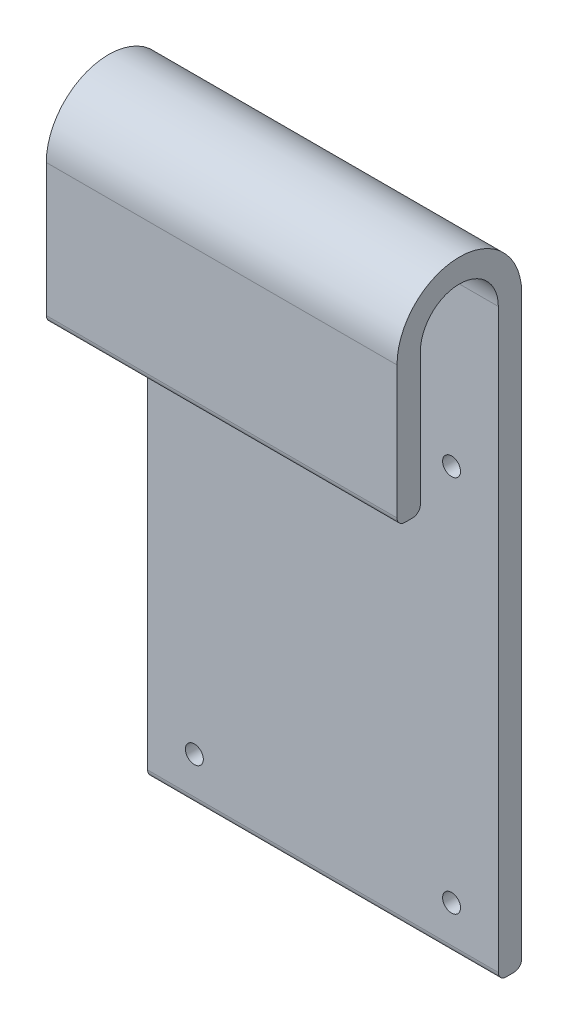
ISO-10303-21;
HEADER;
FILE_DESCRIPTION(('STEP AP214'),'2;1');
FILE_NAME('part.step','',(''),(''),'','','');
FILE_SCHEMA(('AUTOMOTIVE_DESIGN { 1 0 10303 214 1 1 1 1 }'));
ENDSEC;
DATA;
#1=APPLICATION_CONTEXT('core data for automotive mechanical design processes');
#2=APPLICATION_PROTOCOL_DEFINITION('international standard','automotive_design',2000,#1);
#3=PRODUCT_CONTEXT('',#1,'mechanical');
#4=PRODUCT('Part','Part','',(#3));
#5=PRODUCT_RELATED_PRODUCT_CATEGORY('part','',(#4));
#6=PRODUCT_DEFINITION_FORMATION('','',#4);
#7=PRODUCT_DEFINITION_CONTEXT('part definition',#1,'design');
#8=PRODUCT_DEFINITION('design','',#6,#7);
#9=PRODUCT_DEFINITION_SHAPE('','',#8);
#10=(LENGTH_UNIT() NAMED_UNIT(*) SI_UNIT(.MILLI.,.METRE.));
#11=(NAMED_UNIT(*) PLANE_ANGLE_UNIT() SI_UNIT($,.RADIAN.));
#12=(NAMED_UNIT(*) SI_UNIT($,.STERADIAN.) SOLID_ANGLE_UNIT());
#13=UNCERTAINTY_MEASURE_WITH_UNIT(LENGTH_MEASURE(1.E-05),#10,'distance_accuracy_value','');
#14=(GEOMETRIC_REPRESENTATION_CONTEXT(3) GLOBAL_UNCERTAINTY_ASSIGNED_CONTEXT((#13)) GLOBAL_UNIT_ASSIGNED_CONTEXT((#10,
#11,#12)) REPRESENTATION_CONTEXT('',''));
#15=CARTESIAN_POINT('',(0.,0.,0.));
#16=DIRECTION('',(0.,0.,1.));
#17=DIRECTION('',(1.,0.,0.));
#18=AXIS2_PLACEMENT_3D('',#15,#16,#17);
#19=CARTESIAN_POINT('',(22.5,75.,13.));
#20=DIRECTION('',(0.,0.,-1.));
#21=DIRECTION('',(0.,1.,0.));
#22=AXIS2_PLACEMENT_3D('',#19,#20,#21);
#23=PLANE('',#22);
#24=DIRECTION('',(0.,-1.,0.));
#25=VECTOR('',#24,1.);
#26=CARTESIAN_POINT('',(-22.5,75.,13.));
#27=LINE('',#26,#25);
#28=CARTESIAN_POINT('',(-22.5,75.,13.));
#29=VERTEX_POINT('',#28);
#30=CARTESIAN_POINT('',(-22.5,58.,13.));
#31=VERTEX_POINT('',#30);
#32=EDGE_CURVE('E166',#29,#31,#27,.T.);
#33=ORIENTED_EDGE('',*,*,#32,.T.);
#34=DIRECTION('',(-1.,0.,0.));
#35=VECTOR('',#34,1.);
#36=CARTESIAN_POINT('',(22.5,58.,13.));
#37=LINE('',#36,#35);
#38=CARTESIAN_POINT('',(22.5,58.,13.));
#39=VERTEX_POINT('',#38);
#40=EDGE_CURVE('E211',#31,#39,#37,.F.);
#41=ORIENTED_EDGE('',*,*,#40,.T.);
#42=DIRECTION('',(0.,-1.,0.));
#43=VECTOR('',#42,1.);
#44=CARTESIAN_POINT('',(22.5,75.,13.));
#45=LINE('',#44,#43);
#46=CARTESIAN_POINT('',(22.5,75.,13.));
#47=VERTEX_POINT('',#46);
#48=EDGE_CURVE('E185',#47,#39,#45,.T.);
#49=ORIENTED_EDGE('',*,*,#48,.F.);
#50=DIRECTION('',(-1.,0.,0.));
#51=VECTOR('',#50,1.);
#52=CARTESIAN_POINT('',(22.5,75.,13.));
#53=LINE('',#52,#51);
#54=EDGE_CURVE('E165',#47,#29,#53,.T.);
#55=ORIENTED_EDGE('',*,*,#54,.T.);
#56=EDGE_LOOP('',(#33,#41,#49,#55));
#57=FACE_BOUND('',#56,.T.);
#58=ADVANCED_FACE('F39',(#57),#23,.F.);
#59=CARTESIAN_POINT('',(22.5,57.,9.99999999999999));
#60=DIRECTION('',(0.,-1.,0.));
#61=DIRECTION('',(0.,0.,-1.));
#62=AXIS2_PLACEMENT_3D('',#59,#60,#61);
#63=PLANE('',#62);
#64=DIRECTION('',(0.,0.,1.));
#65=VECTOR('',#64,1.);
#66=CARTESIAN_POINT('',(-22.5,57.,9.99999999999999));
#67=LINE('',#66,#65);
#68=CARTESIAN_POINT('',(-22.5,57.,11.));
#69=VERTEX_POINT('',#68);
#70=CARTESIAN_POINT('',(-22.5,57.,12.));
#71=VERTEX_POINT('',#70);
#72=EDGE_CURVE('E169',#69,#71,#67,.T.);
#73=ORIENTED_EDGE('',*,*,#72,.F.);
#74=DIRECTION('',(-1.,0.,0.));
#75=VECTOR('',#74,1.);
#76=CARTESIAN_POINT('',(22.5,57.,11.));
#77=LINE('',#76,#75);
#78=CARTESIAN_POINT('',(22.5,57.,11.));
#79=VERTEX_POINT('',#78);
#80=EDGE_CURVE('E204',#69,#79,#77,.F.);
#81=ORIENTED_EDGE('',*,*,#80,.T.);
#82=DIRECTION('',(0.,0.,1.));
#83=VECTOR('',#82,1.);
#84=CARTESIAN_POINT('',(22.5,57.,9.99999999999999));
#85=LINE('',#84,#83);
#86=CARTESIAN_POINT('',(22.5,57.,12.));
#87=VERTEX_POINT('',#86);
#88=EDGE_CURVE('E149',#79,#87,#85,.T.);
#89=ORIENTED_EDGE('',*,*,#88,.T.);
#90=DIRECTION('',(-1.,0.,0.));
#91=VECTOR('',#90,1.);
#92=CARTESIAN_POINT('',(-22.5,57.,12.));
#93=LINE('',#92,#91);
#94=EDGE_CURVE('E201',#87,#71,#93,.T.);
#95=ORIENTED_EDGE('',*,*,#94,.T.);
#96=EDGE_LOOP('',(#73,#81,#89,#95));
#97=FACE_BOUND('',#96,.T.);
#98=ADVANCED_FACE('F294',(#97),#63,.T.);
#99=CARTESIAN_POINT('',(22.5,75.,10.));
#100=DIRECTION('',(0.,0.,-1.));
#101=DIRECTION('',(0.,1.,0.));
#102=AXIS2_PLACEMENT_3D('',#99,#100,#101);
#103=PLANE('',#102);
#104=DIRECTION('',(0.,-1.,0.));
#105=VECTOR('',#104,1.);
#106=CARTESIAN_POINT('',(22.5,75.,10.));
#107=LINE('',#106,#105);
#108=CARTESIAN_POINT('',(22.5,75.,9.99999999999999));
#109=VERTEX_POINT('',#108);
#110=CARTESIAN_POINT('',(22.5,58.,9.99999999999999));
#111=VERTEX_POINT('',#110);
#112=EDGE_CURVE('E132',#109,#111,#107,.T.);
#113=ORIENTED_EDGE('',*,*,#112,.T.);
#114=DIRECTION('',(-1.,0.,0.));
#115=VECTOR('',#114,1.);
#116=CARTESIAN_POINT('',(22.5,58.,9.99999999999999));
#117=LINE('',#116,#115);
#118=CARTESIAN_POINT('',(-22.5,58.,9.99999999999999));
#119=VERTEX_POINT('',#118);
#120=EDGE_CURVE('E140',#111,#119,#117,.T.);
#121=ORIENTED_EDGE('',*,*,#120,.T.);
#122=DIRECTION('',(0.,-1.,0.));
#123=VECTOR('',#122,1.);
#124=CARTESIAN_POINT('',(-22.5,75.,10.));
#125=LINE('',#124,#123);
#126=CARTESIAN_POINT('',(-22.5,75.,9.99999999999999));
#127=VERTEX_POINT('',#126);
#128=EDGE_CURVE('E135',#127,#119,#125,.T.);
#129=ORIENTED_EDGE('',*,*,#128,.F.);
#130=DIRECTION('',(-1.,0.,0.));
#131=VECTOR('',#130,1.);
#132=CARTESIAN_POINT('',(22.5,75.,9.99999999999999));
#133=LINE('',#132,#131);
#134=EDGE_CURVE('E128',#109,#127,#133,.T.);
#135=ORIENTED_EDGE('',*,*,#134,.F.);
#136=EDGE_LOOP('',(#113,#121,#129,#135));
#137=FACE_BOUND('',#136,.T.);
#138=ADVANCED_FACE('F130',(#137),#103,.T.);
#139=CARTESIAN_POINT('',(22.5,75.,5.));
#140=DIRECTION('',(-1.,0.,0.));
#141=DIRECTION('',(0.,0.,1.));
#142=AXIS2_PLACEMENT_3D('',#139,#140,#141);
#143=CYLINDRICAL_SURFACE('',#142,5.);
#144=CARTESIAN_POINT('',(-22.5,75.,5.));
#145=DIRECTION('',(1.,0.,0.));
#146=DIRECTION('',(0.,0.,-1.));
#147=AXIS2_PLACEMENT_3D('',#144,#145,#146);
#148=CIRCLE('',#147,5.);
#149=CARTESIAN_POINT('',(-22.5,75.,0.));
#150=VERTEX_POINT('',#149);
#151=EDGE_CURVE('E174',#150,#127,#148,.T.);
#152=ORIENTED_EDGE('',*,*,#151,.F.);
#153=DIRECTION('',(-1.,0.,0.));
#154=VECTOR('',#153,1.);
#155=CARTESIAN_POINT('',(22.5,75.,0.));
#156=LINE('',#155,#154);
#157=CARTESIAN_POINT('',(22.5,75.,0.));
#158=VERTEX_POINT('',#157);
#159=EDGE_CURVE('E141',#158,#150,#156,.T.);
#160=ORIENTED_EDGE('',*,*,#159,.F.);
#161=CARTESIAN_POINT('',(22.5,75.,5.));
#162=DIRECTION('',(1.,0.,0.));
#163=DIRECTION('',(0.,0.,-1.));
#164=AXIS2_PLACEMENT_3D('',#161,#162,#163);
#165=CIRCLE('',#164,5.);
#166=EDGE_CURVE('E146',#158,#109,#165,.T.);
#167=ORIENTED_EDGE('',*,*,#166,.T.);
#168=ORIENTED_EDGE('',*,*,#134,.T.);
#169=EDGE_LOOP('',(#152,#160,#167,#168));
#170=FACE_BOUND('',#169,.T.);
#171=ADVANCED_FACE('F152',(#170),#143,.F.);
#172=CARTESIAN_POINT('',(22.5,0.,0.));
#173=DIRECTION('',(0.,0.,1.));
#174=DIRECTION('',(0.,-1.,0.));
#175=AXIS2_PLACEMENT_3D('',#172,#173,#174);
#176=PLANE('',#175);
#177=CARTESIAN_POINT('',(16.4999999999863,5.74578558874435,0.));
#178=DIRECTION('',(0.,0.,1.));
#179=DIRECTION('',(0.,-1.,0.));
#180=AXIS2_PLACEMENT_3D('',#177,#178,#179);
#181=CIRCLE('',#180,1.15);
#182=CARTESIAN_POINT('',(16.4999999999863,4.59578558874435,0.));
#183=VERTEX_POINT('',#182);
#184=EDGE_CURVE('E170',#183,#183,#181,.T.);
#185=ORIENTED_EDGE('',*,*,#184,.F.);
#186=EDGE_LOOP('',(#185));
#187=FACE_BOUND('',#186,.T.);
#188=CARTESIAN_POINT('',(-16.5000000000137,5.74578558874388,0.));
#189=DIRECTION('',(0.,0.,1.));
#190=DIRECTION('',(0.,-1.,0.));
#191=AXIS2_PLACEMENT_3D('',#188,#189,#190);
#192=CIRCLE('',#191,1.15);
#193=CARTESIAN_POINT('',(-16.5000000000137,4.59578558874387,0.));
#194=VERTEX_POINT('',#193);
#195=EDGE_CURVE('E248',#194,#194,#192,.T.);
#196=ORIENTED_EDGE('',*,*,#195,.F.);
#197=EDGE_LOOP('',(#196));
#198=FACE_BOUND('',#197,.T.);
#199=CARTESIAN_POINT('',(-16.5000000000144,54.2457855887439,0.));
#200=DIRECTION('',(0.,0.,1.));
#201=DIRECTION('',(0.,-1.,0.));
#202=AXIS2_PLACEMENT_3D('',#199,#200,#201);
#203=CIRCLE('',#202,1.15);
#204=CARTESIAN_POINT('',(-16.5000000000144,53.0957855887439,0.));
#205=VERTEX_POINT('',#204);
#206=EDGE_CURVE('E251',#205,#205,#203,.T.);
#207=ORIENTED_EDGE('',*,*,#206,.F.);
#208=EDGE_LOOP('',(#207));
#209=FACE_BOUND('',#208,.T.);
#210=CARTESIAN_POINT('',(16.4999999999856,54.2457855887443,0.));
#211=DIRECTION('',(0.,0.,1.));
#212=DIRECTION('',(0.,-1.,0.));
#213=AXIS2_PLACEMENT_3D('',#210,#211,#212);
#214=CIRCLE('',#213,1.15);
#215=CARTESIAN_POINT('',(16.4999999999856,53.0957855887443,0.));
#216=VERTEX_POINT('',#215);
#217=EDGE_CURVE('E254',#216,#216,#214,.T.);
#218=ORIENTED_EDGE('',*,*,#217,.F.);
#219=EDGE_LOOP('',(#218));
#220=FACE_BOUND('',#219,.T.);
#221=DIRECTION('',(0.,1.,0.));
#222=VECTOR('',#221,1.);
#223=CARTESIAN_POINT('',(-22.5,0.,0.));
#224=LINE('',#223,#222);
#225=CARTESIAN_POINT('',(-22.5,1.,0.));
#226=VERTEX_POINT('',#225);
#227=EDGE_CURVE('E176',#226,#150,#224,.T.);
#228=ORIENTED_EDGE('',*,*,#227,.F.);
#229=DIRECTION('',(-1.,0.,0.));
#230=VECTOR('',#229,1.);
#231=CARTESIAN_POINT('',(22.5,1.,0.));
#232=LINE('',#231,#230);
#233=CARTESIAN_POINT('',(22.5,1.,0.));
#234=VERTEX_POINT('',#233);
#235=EDGE_CURVE('E11',#226,#234,#232,.F.);
#236=ORIENTED_EDGE('',*,*,#235,.T.);
#237=DIRECTION('',(0.,1.,0.));
#238=VECTOR('',#237,1.);
#239=CARTESIAN_POINT('',(22.5,0.,0.));
#240=LINE('',#239,#238);
#241=EDGE_CURVE('E154',#234,#158,#240,.T.);
#242=ORIENTED_EDGE('',*,*,#241,.T.);
#243=ORIENTED_EDGE('',*,*,#159,.T.);
#244=EDGE_LOOP('',(#228,#236,#242,#243));
#245=FACE_BOUND('',#244,.T.);
#246=ADVANCED_FACE('F322',(#187,#198,#209,#220,#245),#176,.T.);
#247=CARTESIAN_POINT('',(22.5,0.,-3.));
#248=DIRECTION('',(0.,-1.,0.));
#249=DIRECTION('',(0.,0.,-1.));
#250=AXIS2_PLACEMENT_3D('',#247,#248,#249);
#251=PLANE('',#250);
#252=DIRECTION('',(0.,0.,1.));
#253=VECTOR('',#252,1.);
#254=CARTESIAN_POINT('',(-22.5,0.,-3.));
#255=LINE('',#254,#253);
#256=CARTESIAN_POINT('',(-22.5,0.,-2.));
#257=VERTEX_POINT('',#256);
#258=CARTESIAN_POINT('',(-22.5,0.,-1.));
#259=VERTEX_POINT('',#258);
#260=EDGE_CURVE('E178',#257,#259,#255,.T.);
#261=ORIENTED_EDGE('',*,*,#260,.F.);
#262=DIRECTION('',(-1.,0.,0.));
#263=VECTOR('',#262,1.);
#264=CARTESIAN_POINT('',(22.5,0.,-2.));
#265=LINE('',#264,#263);
#266=CARTESIAN_POINT('',(22.5,0.,-2.));
#267=VERTEX_POINT('',#266);
#268=EDGE_CURVE('E47',#257,#267,#265,.F.);
#269=ORIENTED_EDGE('',*,*,#268,.T.);
#270=DIRECTION('',(0.,0.,1.));
#271=VECTOR('',#270,1.);
#272=CARTESIAN_POINT('',(22.5,0.,-3.));
#273=LINE('',#272,#271);
#274=CARTESIAN_POINT('',(22.5,0.,-1.));
#275=VERTEX_POINT('',#274);
#276=EDGE_CURVE('E156',#267,#275,#273,.T.);
#277=ORIENTED_EDGE('',*,*,#276,.T.);
#278=DIRECTION('',(-1.,0.,0.));
#279=VECTOR('',#278,1.);
#280=CARTESIAN_POINT('',(22.5,0.,-1.));
#281=LINE('',#280,#279);
#282=EDGE_CURVE('E216',#275,#259,#281,.T.);
#283=ORIENTED_EDGE('',*,*,#282,.T.);
#284=EDGE_LOOP('',(#261,#269,#277,#283));
#285=FACE_BOUND('',#284,.T.);
#286=ADVANCED_FACE('F221',(#285),#251,.T.);
#287=CARTESIAN_POINT('',(22.5,0.,-3.));
#288=DIRECTION('',(0.,0.,1.));
#289=DIRECTION('',(0.,-1.,0.));
#290=AXIS2_PLACEMENT_3D('',#287,#288,#289);
#291=PLANE('',#290);
#292=CARTESIAN_POINT('',(16.4999999999863,5.74578558874435,-3.));
#293=DIRECTION('',(0.,0.,-1.));
#294=DIRECTION('',(-1.,0.,0.));
#295=AXIS2_PLACEMENT_3D('',#292,#293,#294);
#296=CIRCLE('',#295,1.15);
#297=CARTESIAN_POINT('',(15.3499999999863,5.74578558874435,-3.));
#298=VERTEX_POINT('',#297);
#299=EDGE_CURVE('E261',#298,#298,#296,.T.);
#300=ORIENTED_EDGE('',*,*,#299,.F.);
#301=EDGE_LOOP('',(#300));
#302=FACE_BOUND('',#301,.T.);
#303=CARTESIAN_POINT('',(-16.5000000000137,5.74578558874388,-3.));
#304=DIRECTION('',(0.,0.,-1.));
#305=DIRECTION('',(-1.,0.,0.));
#306=AXIS2_PLACEMENT_3D('',#303,#304,#305);
#307=CIRCLE('',#306,1.15);
#308=CARTESIAN_POINT('',(-17.6500000000137,5.74578558874388,-3.));
#309=VERTEX_POINT('',#308);
#310=EDGE_CURVE('E264',#309,#309,#307,.T.);
#311=ORIENTED_EDGE('',*,*,#310,.F.);
#312=EDGE_LOOP('',(#311));
#313=FACE_BOUND('',#312,.T.);
#314=CARTESIAN_POINT('',(-16.5000000000144,54.2457855887439,-3.));
#315=DIRECTION('',(0.,0.,-1.));
#316=DIRECTION('',(-1.,0.,0.));
#317=AXIS2_PLACEMENT_3D('',#314,#315,#316);
#318=CIRCLE('',#317,1.15);
#319=CARTESIAN_POINT('',(-17.6500000000144,54.2457855887439,-3.));
#320=VERTEX_POINT('',#319);
#321=EDGE_CURVE('E260',#320,#320,#318,.T.);
#322=ORIENTED_EDGE('',*,*,#321,.F.);
#323=EDGE_LOOP('',(#322));
#324=FACE_BOUND('',#323,.T.);
#325=CARTESIAN_POINT('',(16.4999999999856,54.2457855887443,-3.));
#326=DIRECTION('',(0.,0.,-1.));
#327=DIRECTION('',(-1.,0.,0.));
#328=AXIS2_PLACEMENT_3D('',#325,#326,#327);
#329=CIRCLE('',#328,1.15);
#330=CARTESIAN_POINT('',(15.3499999999856,54.2457855887443,-3.));
#331=VERTEX_POINT('',#330);
#332=EDGE_CURVE('E257',#331,#331,#329,.T.);
#333=ORIENTED_EDGE('',*,*,#332,.F.);
#334=EDGE_LOOP('',(#333));
#335=FACE_BOUND('',#334,.T.);
#336=DIRECTION('',(0.,1.,0.));
#337=VECTOR('',#336,1.);
#338=CARTESIAN_POINT('',(22.5,0.,-3.));
#339=LINE('',#338,#337);
#340=CARTESIAN_POINT('',(22.5,0.999999999999999,-3.));
#341=VERTEX_POINT('',#340);
#342=CARTESIAN_POINT('',(22.5,75.,-3.));
#343=VERTEX_POINT('',#342);
#344=EDGE_CURVE('E161',#341,#343,#339,.T.);
#345=ORIENTED_EDGE('',*,*,#344,.F.);
#346=DIRECTION('',(-1.,0.,0.));
#347=VECTOR('',#346,1.);
#348=CARTESIAN_POINT('',(-22.5,0.999999999999999,-3.));
#349=LINE('',#348,#347);
#350=CARTESIAN_POINT('',(-22.5,0.999999999999999,-3.));
#351=VERTEX_POINT('',#350);
#352=EDGE_CURVE('E213',#341,#351,#349,.T.);
#353=ORIENTED_EDGE('',*,*,#352,.T.);
#354=DIRECTION('',(0.,1.,0.));
#355=VECTOR('',#354,1.);
#356=CARTESIAN_POINT('',(-22.5,0.,-3.));
#357=LINE('',#356,#355);
#358=CARTESIAN_POINT('',(-22.5,75.,-3.));
#359=VERTEX_POINT('',#358);
#360=EDGE_CURVE('E181',#351,#359,#357,.T.);
#361=ORIENTED_EDGE('',*,*,#360,.T.);
#362=DIRECTION('',(-1.,0.,0.));
#363=VECTOR('',#362,1.);
#364=CARTESIAN_POINT('',(22.5,75.,-3.));
#365=LINE('',#364,#363);
#366=EDGE_CURVE('E188',#343,#359,#365,.T.);
#367=ORIENTED_EDGE('',*,*,#366,.F.);
#368=EDGE_LOOP('',(#345,#353,#361,#367));
#369=FACE_BOUND('',#368,.T.);
#370=ADVANCED_FACE('F228',(#302,#313,#324,#335,#369),#291,.F.);
#371=CARTESIAN_POINT('',(22.5,75.,5.));
#372=DIRECTION('',(-1.,0.,0.));
#373=DIRECTION('',(0.,0.,1.));
#374=AXIS2_PLACEMENT_3D('',#371,#372,#373);
#375=CYLINDRICAL_SURFACE('',#374,8.);
#376=CARTESIAN_POINT('',(-22.5,75.,5.));
#377=DIRECTION('',(1.,0.,0.));
#378=DIRECTION('',(0.,0.,-1.));
#379=AXIS2_PLACEMENT_3D('',#376,#377,#378);
#380=CIRCLE('',#379,8.);
#381=EDGE_CURVE('E183',#359,#29,#380,.T.);
#382=ORIENTED_EDGE('',*,*,#381,.T.);
#383=ORIENTED_EDGE('',*,*,#54,.F.);
#384=CARTESIAN_POINT('',(22.5,75.,5.));
#385=DIRECTION('',(1.,0.,0.));
#386=DIRECTION('',(0.,0.,-1.));
#387=AXIS2_PLACEMENT_3D('',#384,#385,#386);
#388=CIRCLE('',#387,8.);
#389=EDGE_CURVE('E163',#343,#47,#388,.T.);
#390=ORIENTED_EDGE('',*,*,#389,.F.);
#391=ORIENTED_EDGE('',*,*,#366,.T.);
#392=EDGE_LOOP('',(#382,#383,#390,#391));
#393=FACE_BOUND('',#392,.T.);
#394=ADVANCED_FACE('F236',(#393),#375,.T.);
#395=CARTESIAN_POINT('',(22.5,75.,5.));
#396=DIRECTION('',(1.,0.,0.));
#397=DIRECTION('',(0.,0.,-1.));
#398=AXIS2_PLACEMENT_3D('',#395,#396,#397);
#399=PLANE('',#398);
#400=ORIENTED_EDGE('',*,*,#88,.F.);
#401=CARTESIAN_POINT('',(22.5,58.,11.));
#402=DIRECTION('',(1.,0.,0.));
#403=DIRECTION('',(0.,0.,-1.));
#404=AXIS2_PLACEMENT_3D('',#401,#402,#403);
#405=CIRCLE('',#404,1.);
#406=EDGE_CURVE('E148',#79,#111,#405,.T.);
#407=ORIENTED_EDGE('',*,*,#406,.T.);
#408=ORIENTED_EDGE('',*,*,#112,.F.);
#409=ORIENTED_EDGE('',*,*,#166,.F.);
#410=ORIENTED_EDGE('',*,*,#241,.F.);
#411=CARTESIAN_POINT('',(22.5,1.,-1.));
#412=DIRECTION('',(1.,0.,0.));
#413=DIRECTION('',(0.,0.,-1.));
#414=AXIS2_PLACEMENT_3D('',#411,#412,#413);
#415=CIRCLE('',#414,1.);
#416=EDGE_CURVE('E60',#234,#275,#415,.T.);
#417=ORIENTED_EDGE('',*,*,#416,.T.);
#418=ORIENTED_EDGE('',*,*,#276,.F.);
#419=CARTESIAN_POINT('',(22.5,0.999999999999999,-2.));
#420=DIRECTION('',(1.,0.,0.));
#421=DIRECTION('',(0.,0.,-1.));
#422=AXIS2_PLACEMENT_3D('',#419,#420,#421);
#423=CIRCLE('',#422,1.);
#424=EDGE_CURVE('E54',#267,#341,#423,.T.);
#425=ORIENTED_EDGE('',*,*,#424,.T.);
#426=ORIENTED_EDGE('',*,*,#344,.T.);
#427=ORIENTED_EDGE('',*,*,#389,.T.);
#428=ORIENTED_EDGE('',*,*,#48,.T.);
#429=CARTESIAN_POINT('',(22.5,58.,12.));
#430=DIRECTION('',(1.,0.,0.));
#431=DIRECTION('',(0.,0.,-1.));
#432=AXIS2_PLACEMENT_3D('',#429,#430,#431);
#433=CIRCLE('',#432,1.);
#434=EDGE_CURVE('E208',#39,#87,#433,.T.);
#435=ORIENTED_EDGE('',*,*,#434,.T.);
#436=EDGE_LOOP('',(#400,#407,#408,#409,#410,#417,#418,#425,#426,#427,#428,#435));
#437=FACE_BOUND('',#436,.T.);
#438=ADVANCED_FACE('F145',(#437),#399,.T.);
#439=CARTESIAN_POINT('',(-22.5,75.,5.));
#440=DIRECTION('',(1.,0.,0.));
#441=DIRECTION('',(0.,0.,-1.));
#442=AXIS2_PLACEMENT_3D('',#439,#440,#441);
#443=PLANE('',#442);
#444=ORIENTED_EDGE('',*,*,#128,.T.);
#445=CARTESIAN_POINT('',(-22.5,58.,11.));
#446=DIRECTION('',(1.,0.,0.));
#447=DIRECTION('',(0.,0.,-1.));
#448=AXIS2_PLACEMENT_3D('',#445,#446,#447);
#449=CIRCLE('',#448,1.);
#450=EDGE_CURVE('E199',#119,#69,#449,.F.);
#451=ORIENTED_EDGE('',*,*,#450,.T.);
#452=ORIENTED_EDGE('',*,*,#72,.T.);
#453=CARTESIAN_POINT('',(-22.5,58.,12.));
#454=DIRECTION('',(1.,0.,0.));
#455=DIRECTION('',(0.,0.,-1.));
#456=AXIS2_PLACEMENT_3D('',#453,#454,#455);
#457=CIRCLE('',#456,1.);
#458=EDGE_CURVE('E197',#71,#31,#457,.F.);
#459=ORIENTED_EDGE('',*,*,#458,.T.);
#460=ORIENTED_EDGE('',*,*,#32,.F.);
#461=ORIENTED_EDGE('',*,*,#381,.F.);
#462=ORIENTED_EDGE('',*,*,#360,.F.);
#463=CARTESIAN_POINT('',(-22.5,0.999999999999999,-2.));
#464=DIRECTION('',(1.,0.,0.));
#465=DIRECTION('',(0.,0.,-1.));
#466=AXIS2_PLACEMENT_3D('',#463,#464,#465);
#467=CIRCLE('',#466,1.);
#468=EDGE_CURVE('E195',#351,#257,#467,.F.);
#469=ORIENTED_EDGE('',*,*,#468,.T.);
#470=ORIENTED_EDGE('',*,*,#260,.T.);
#471=CARTESIAN_POINT('',(-22.5,1.,-1.));
#472=DIRECTION('',(1.,0.,0.));
#473=DIRECTION('',(0.,0.,-1.));
#474=AXIS2_PLACEMENT_3D('',#471,#472,#473);
#475=CIRCLE('',#474,1.);
#476=EDGE_CURVE('E193',#259,#226,#475,.F.);
#477=ORIENTED_EDGE('',*,*,#476,.T.);
#478=ORIENTED_EDGE('',*,*,#227,.T.);
#479=ORIENTED_EDGE('',*,*,#151,.T.);
#480=EDGE_LOOP('',(#444,#451,#452,#459,#460,#461,#462,#469,#470,#477,#478,#479));
#481=FACE_BOUND('',#480,.T.);
#482=ADVANCED_FACE('F232',(#481),#443,.F.);
#483=CARTESIAN_POINT('',(16.4999999999856,54.2457855887443,13.));
#484=DIRECTION('',(0.,0.,-1.));
#485=DIRECTION('',(-1.,0.,0.));
#486=AXIS2_PLACEMENT_3D('',#483,#484,#485);
#487=CYLINDRICAL_SURFACE('',#486,1.15);
#488=ORIENTED_EDGE('',*,*,#217,.T.);
#489=EDGE_LOOP('',(#488));
#490=FACE_BOUND('',#489,.T.);
#491=ORIENTED_EDGE('',*,*,#332,.T.);
#492=EDGE_LOOP('',(#491));
#493=FACE_BOUND('',#492,.T.);
#494=ADVANCED_FACE('F278',(#490,#493),#487,.F.);
#495=CARTESIAN_POINT('',(-16.5000000000144,54.2457855887439,13.));
#496=DIRECTION('',(0.,0.,-1.));
#497=DIRECTION('',(-1.,0.,0.));
#498=AXIS2_PLACEMENT_3D('',#495,#496,#497);
#499=CYLINDRICAL_SURFACE('',#498,1.15);
#500=ORIENTED_EDGE('',*,*,#206,.T.);
#501=EDGE_LOOP('',(#500));
#502=FACE_BOUND('',#501,.T.);
#503=ORIENTED_EDGE('',*,*,#321,.T.);
#504=EDGE_LOOP('',(#503));
#505=FACE_BOUND('',#504,.T.);
#506=ADVANCED_FACE('F270',(#502,#505),#499,.F.);
#507=CARTESIAN_POINT('',(-16.5000000000137,5.74578558874388,13.));
#508=DIRECTION('',(0.,0.,-1.));
#509=DIRECTION('',(-1.,0.,0.));
#510=AXIS2_PLACEMENT_3D('',#507,#508,#509);
#511=CYLINDRICAL_SURFACE('',#510,1.15);
#512=ORIENTED_EDGE('',*,*,#195,.T.);
#513=EDGE_LOOP('',(#512));
#514=FACE_BOUND('',#513,.T.);
#515=ORIENTED_EDGE('',*,*,#310,.T.);
#516=EDGE_LOOP('',(#515));
#517=FACE_BOUND('',#516,.T.);
#518=ADVANCED_FACE('F286',(#514,#517),#511,.F.);
#519=CARTESIAN_POINT('',(16.4999999999863,5.74578558874435,13.));
#520=DIRECTION('',(0.,0.,-1.));
#521=DIRECTION('',(-1.,0.,0.));
#522=AXIS2_PLACEMENT_3D('',#519,#520,#521);
#523=CYLINDRICAL_SURFACE('',#522,1.15);
#524=ORIENTED_EDGE('',*,*,#184,.T.);
#525=EDGE_LOOP('',(#524));
#526=FACE_BOUND('',#525,.T.);
#527=ORIENTED_EDGE('',*,*,#299,.T.);
#528=EDGE_LOOP('',(#527));
#529=FACE_BOUND('',#528,.T.);
#530=ADVANCED_FACE('F308',(#526,#529),#523,.F.);
#531=CARTESIAN_POINT('',(22.5,58.,11.));
#532=DIRECTION('',(-1.,0.,0.));
#533=DIRECTION('',(0.,0.,1.));
#534=AXIS2_PLACEMENT_3D('',#531,#532,#533);
#535=CYLINDRICAL_SURFACE('',#534,1.);
#536=ORIENTED_EDGE('',*,*,#406,.F.);
#537=ORIENTED_EDGE('',*,*,#80,.F.);
#538=ORIENTED_EDGE('',*,*,#450,.F.);
#539=ORIENTED_EDGE('',*,*,#120,.F.);
#540=EDGE_LOOP('',(#536,#537,#538,#539));
#541=FACE_BOUND('',#540,.T.);
#542=ADVANCED_FACE('F304',(#541),#535,.T.);
#543=CARTESIAN_POINT('',(22.5,58.,12.));
#544=DIRECTION('',(1.,0.,0.));
#545=DIRECTION('',(0.,0.,-1.));
#546=AXIS2_PLACEMENT_3D('',#543,#544,#545);
#547=CYLINDRICAL_SURFACE('',#546,1.);
#548=ORIENTED_EDGE('',*,*,#434,.F.);
#549=ORIENTED_EDGE('',*,*,#40,.F.);
#550=ORIENTED_EDGE('',*,*,#458,.F.);
#551=ORIENTED_EDGE('',*,*,#94,.F.);
#552=EDGE_LOOP('',(#548,#549,#550,#551));
#553=FACE_BOUND('',#552,.T.);
#554=ADVANCED_FACE('F307',(#553),#547,.T.);
#555=CARTESIAN_POINT('',(22.5,0.999999999999999,-2.));
#556=DIRECTION('',(1.,0.,0.));
#557=DIRECTION('',(0.,0.,-1.));
#558=AXIS2_PLACEMENT_3D('',#555,#556,#557);
#559=CYLINDRICAL_SURFACE('',#558,1.);
#560=ORIENTED_EDGE('',*,*,#424,.F.);
#561=ORIENTED_EDGE('',*,*,#268,.F.);
#562=ORIENTED_EDGE('',*,*,#468,.F.);
#563=ORIENTED_EDGE('',*,*,#352,.F.);
#564=EDGE_LOOP('',(#560,#561,#562,#563));
#565=FACE_BOUND('',#564,.T.);
#566=ADVANCED_FACE('F225',(#565),#559,.T.);
#567=CARTESIAN_POINT('',(22.5,1.,-1.));
#568=DIRECTION('',(-1.,0.,0.));
#569=DIRECTION('',(0.,0.,1.));
#570=AXIS2_PLACEMENT_3D('',#567,#568,#569);
#571=CYLINDRICAL_SURFACE('',#570,1.);
#572=ORIENTED_EDGE('',*,*,#416,.F.);
#573=ORIENTED_EDGE('',*,*,#235,.F.);
#574=ORIENTED_EDGE('',*,*,#476,.F.);
#575=ORIENTED_EDGE('',*,*,#282,.F.);
#576=EDGE_LOOP('',(#572,#573,#574,#575));
#577=FACE_BOUND('',#576,.T.);
#578=ADVANCED_FACE('F41',(#577),#571,.T.);
#579=CLOSED_SHELL('',(#58,#98,#138,#171,#246,#286,#370,#394,#438,#482,#494,#506,#518,#530,#542,
#554,#566,#578));
#580=MANIFOLD_SOLID_BREP('B2',#579);
#581=ADVANCED_BREP_SHAPE_REPRESENTATION('',(#18,#580),#14);
#582=SHAPE_DEFINITION_REPRESENTATION(#9,#581);
ENDSEC;
END-ISO-10303-21;
